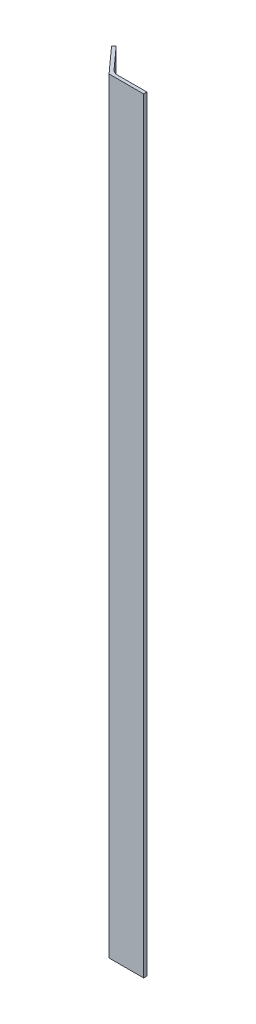
ISO-10303-21;
HEADER;
FILE_DESCRIPTION(('STEP AP214'),'2;1');
FILE_NAME('part.step','',(''),(''),'','','');
FILE_SCHEMA(('AUTOMOTIVE_DESIGN { 1 0 10303 214 1 1 1 1 }'));
ENDSEC;
DATA;
#1=APPLICATION_CONTEXT('core data for automotive mechanical design processes');
#2=APPLICATION_PROTOCOL_DEFINITION('international standard','automotive_design',2000,#1);
#3=PRODUCT_CONTEXT('',#1,'mechanical');
#4=PRODUCT('Part','Part','',(#3));
#5=PRODUCT_RELATED_PRODUCT_CATEGORY('part','',(#4));
#6=PRODUCT_DEFINITION_FORMATION('','',#4);
#7=PRODUCT_DEFINITION_CONTEXT('part definition',#1,'design');
#8=PRODUCT_DEFINITION('design','',#6,#7);
#9=PRODUCT_DEFINITION_SHAPE('','',#8);
#10=(LENGTH_UNIT() NAMED_UNIT(*) SI_UNIT(.MILLI.,.METRE.));
#11=(NAMED_UNIT(*) PLANE_ANGLE_UNIT() SI_UNIT($,.RADIAN.));
#12=(NAMED_UNIT(*) SI_UNIT($,.STERADIAN.) SOLID_ANGLE_UNIT());
#13=UNCERTAINTY_MEASURE_WITH_UNIT(LENGTH_MEASURE(1.E-05),#10,'distance_accuracy_value','');
#14=(GEOMETRIC_REPRESENTATION_CONTEXT(3) GLOBAL_UNCERTAINTY_ASSIGNED_CONTEXT((#13)) GLOBAL_UNIT_ASSIGNED_CONTEXT((#10,
#11,#12)) REPRESENTATION_CONTEXT('',''));
#15=CARTESIAN_POINT('',(0.,0.,0.));
#16=DIRECTION('',(0.,0.,1.));
#17=DIRECTION('',(1.,0.,0.));
#18=AXIS2_PLACEMENT_3D('',#15,#16,#17);
#19=CARTESIAN_POINT('',(-0.931762463434703,40.,-5.48688166985293));
#20=DIRECTION('',(0.,-1.,0.));
#21=DIRECTION('',(0.,0.,-1.));
#22=AXIS2_PLACEMENT_3D('',#19,#20,#21);
#23=PLANE('',#22);
#24=CARTESIAN_POINT('',(-0.931762463434703,40.,-5.48688166985293));
#25=DIRECTION('',(0.,-1.,0.));
#26=DIRECTION('',(0.,0.,-1.));
#27=AXIS2_PLACEMENT_3D('',#24,#25,#26);
#28=CIRCLE('',#27,5.);
#29=CARTESIAN_POINT('',(-0.931762463434703,40.,-0.486881669852926));
#30=VERTEX_POINT('',#29);
#31=CARTESIAN_POINT('',(-4.64357419114649,40.,-2.13688858060315));
#32=VERTEX_POINT('',#31);
#33=EDGE_CURVE('E106',#30,#32,#28,.T.);
#34=ORIENTED_EDGE('',*,*,#33,.F.);
#35=DIRECTION('',(-1.,0.,0.));
#36=VECTOR('',#35,1.);
#37=CARTESIAN_POINT('',(-0.931762463434703,40.,-0.486881669852926));
#38=LINE('',#37,#36);
#39=CARTESIAN_POINT('',(17.1228290420735,40.,-0.486881669852926));
#40=VERTEX_POINT('',#39);
#41=EDGE_CURVE('E127',#40,#30,#38,.T.);
#42=ORIENTED_EDGE('',*,*,#41,.F.);
#43=DIRECTION('',(0.,0.,-1.));
#44=VECTOR('',#43,1.);
#45=CARTESIAN_POINT('',(17.1228290420735,40.,1.51311833014707));
#46=LINE('',#45,#44);
#47=CARTESIAN_POINT('',(17.1228290420735,40.,1.51311833014707));
#48=VERTEX_POINT('',#47);
#49=EDGE_CURVE('E124',#48,#40,#46,.T.);
#50=ORIENTED_EDGE('',*,*,#49,.F.);
#51=DIRECTION('',(1.,0.,0.));
#52=VECTOR('',#51,1.);
#53=CARTESIAN_POINT('',(-4.04346349315579,40.,1.51311833014707));
#54=LINE('',#53,#52);
#55=CARTESIAN_POINT('',(-4.04346349315579,40.,1.51311833014707));
#56=VERTEX_POINT('',#55);
#57=EDGE_CURVE('E121',#56,#48,#54,.T.);
#58=ORIENTED_EDGE('',*,*,#57,.F.);
#59=DIRECTION('',(0.669998617849955,0.,0.742362345542357));
#60=VECTOR('',#59,1.);
#61=CARTESIAN_POINT('',(-18.0829321574702,40.,-14.0426941896676));
#62=LINE('',#61,#60);
#63=CARTESIAN_POINT('',(-18.0829321574702,40.,-14.0426941896676));
#64=VERTEX_POINT('',#63);
#65=EDGE_CURVE('E118',#64,#56,#62,.T.);
#66=ORIENTED_EDGE('',*,*,#65,.F.);
#67=DIRECTION('',(-0.742362345542357,0.,0.669998617849955));
#68=VECTOR('',#67,1.);
#69=CARTESIAN_POINT('',(-18.0829321574702,40.,-14.0426941896676));
#70=LINE('',#69,#68);
#71=CARTESIAN_POINT('',(-16.5982074663855,40.,-15.3826914253675));
#72=VERTEX_POINT('',#71);
#73=EDGE_CURVE('E109',#72,#64,#70,.T.);
#74=ORIENTED_EDGE('',*,*,#73,.F.);
#75=DIRECTION('',(-0.669998617849955,0.,-0.742362345542357));
#76=VECTOR('',#75,1.);
#77=CARTESIAN_POINT('',(-16.5982074663855,40.,-15.3826914253675));
#78=LINE('',#77,#76);
#79=EDGE_CURVE('E98',#32,#72,#78,.T.);
#80=ORIENTED_EDGE('',*,*,#79,.F.);
#81=EDGE_LOOP('',(#34,#42,#50,#58,#66,#74,#80));
#82=FACE_BOUND('',#81,.T.);
#83=ADVANCED_FACE('F33',(#82),#23,.T.);
#84=CARTESIAN_POINT('',(-0.931762463434703,547.26382067791,-0.486881669852926));
#85=DIRECTION('',(0.,0.,1.));
#86=DIRECTION('',(1.,0.,0.));
#87=AXIS2_PLACEMENT_3D('',#84,#85,#86);
#88=PLANE('',#87);
#89=DIRECTION('',(0.,-1.,0.));
#90=VECTOR('',#89,1.);
#91=CARTESIAN_POINT('',(-0.931762463434703,547.26382067791,-0.486881669852926));
#92=LINE('',#91,#90);
#93=CARTESIAN_POINT('',(-0.931762463434703,508.213673316679,-0.486881669852926));
#94=VERTEX_POINT('',#93);
#95=EDGE_CURVE('E112',#94,#30,#92,.T.);
#96=ORIENTED_EDGE('',*,*,#95,.F.);
#97=DIRECTION('',(1.,0.,0.));
#98=VECTOR('',#97,1.);
#99=CARTESIAN_POINT('',(-0.931762463434703,508.213673316679,-0.486881669852926));
#100=LINE('',#99,#98);
#101=CARTESIAN_POINT('',(17.1228290420735,508.213673316679,-0.486881669852926));
#102=VERTEX_POINT('',#101);
#103=EDGE_CURVE('E37',#94,#102,#100,.T.);
#104=ORIENTED_EDGE('',*,*,#103,.T.);
#105=DIRECTION('',(0.,-1.,0.));
#106=VECTOR('',#105,1.);
#107=CARTESIAN_POINT('',(17.1228290420735,547.26382067791,-0.486881669852926));
#108=LINE('',#107,#106);
#109=EDGE_CURVE('E130',#102,#40,#108,.T.);
#110=ORIENTED_EDGE('',*,*,#109,.T.);
#111=ORIENTED_EDGE('',*,*,#41,.T.);
#112=EDGE_LOOP('',(#96,#104,#110,#111));
#113=FACE_BOUND('',#112,.T.);
#114=ADVANCED_FACE('F152',(#113),#88,.F.);
#115=CARTESIAN_POINT('',(17.1228290420735,547.26382067791,1.51311833014707));
#116=DIRECTION('',(-1.,0.,0.));
#117=DIRECTION('',(0.,0.,1.));
#118=AXIS2_PLACEMENT_3D('',#115,#116,#117);
#119=PLANE('',#118);
#120=ORIENTED_EDGE('',*,*,#109,.F.);
#121=DIRECTION('',(0.,0.,1.));
#122=VECTOR('',#121,1.);
#123=CARTESIAN_POINT('',(17.1228290420735,508.213673316679,1.51311833014707));
#124=LINE('',#123,#122);
#125=CARTESIAN_POINT('',(17.1228290420735,508.213673316679,1.51311833014707));
#126=VERTEX_POINT('',#125);
#127=EDGE_CURVE('E146',#102,#126,#124,.T.);
#128=ORIENTED_EDGE('',*,*,#127,.T.);
#129=DIRECTION('',(0.,-1.,0.));
#130=VECTOR('',#129,1.);
#131=CARTESIAN_POINT('',(17.1228290420735,547.26382067791,1.51311833014707));
#132=LINE('',#131,#130);
#133=EDGE_CURVE('E132',#126,#48,#132,.T.);
#134=ORIENTED_EDGE('',*,*,#133,.T.);
#135=ORIENTED_EDGE('',*,*,#49,.T.);
#136=EDGE_LOOP('',(#120,#128,#134,#135));
#137=FACE_BOUND('',#136,.T.);
#138=ADVANCED_FACE('F154',(#137),#119,.F.);
#139=CARTESIAN_POINT('',(-4.04346349315579,547.26382067791,1.51311833014707));
#140=DIRECTION('',(0.,0.,-1.));
#141=DIRECTION('',(-1.,0.,0.));
#142=AXIS2_PLACEMENT_3D('',#139,#140,#141);
#143=PLANE('',#142);
#144=ORIENTED_EDGE('',*,*,#133,.F.);
#145=DIRECTION('',(-1.,0.,0.));
#146=VECTOR('',#145,1.);
#147=CARTESIAN_POINT('',(-4.04346349315579,508.213673316679,1.51311833014707));
#148=LINE('',#147,#146);
#149=CARTESIAN_POINT('',(-4.04346349315579,508.213673316679,1.51311833014707));
#150=VERTEX_POINT('',#149);
#151=EDGE_CURVE('E52',#126,#150,#148,.T.);
#152=ORIENTED_EDGE('',*,*,#151,.T.);
#153=DIRECTION('',(0.,-1.,0.));
#154=VECTOR('',#153,1.);
#155=CARTESIAN_POINT('',(-4.04346349315579,547.26382067791,1.51311833014707));
#156=LINE('',#155,#154);
#157=EDGE_CURVE('E134',#150,#56,#156,.T.);
#158=ORIENTED_EDGE('',*,*,#157,.T.);
#159=ORIENTED_EDGE('',*,*,#57,.T.);
#160=EDGE_LOOP('',(#144,#152,#158,#159));
#161=FACE_BOUND('',#160,.T.);
#162=ADVANCED_FACE('F158',(#161),#143,.F.);
#163=CARTESIAN_POINT('',(-18.0829321574702,547.26382067791,-14.0426941896676));
#164=DIRECTION('',(0.742362345542357,0.,-0.669998617849955));
#165=DIRECTION('',(-0.669998617849955,0.,-0.742362345542357));
#166=AXIS2_PLACEMENT_3D('',#163,#164,#165);
#167=PLANE('',#166);
#168=ORIENTED_EDGE('',*,*,#157,.F.);
#169=DIRECTION('',(-0.669998617849955,0.,-0.742362345542357));
#170=VECTOR('',#169,1.);
#171=CARTESIAN_POINT('',(-18.0829321574702,508.213673316679,-14.0426941896676));
#172=LINE('',#171,#170);
#173=CARTESIAN_POINT('',(-18.0829321574702,508.213673316679,-14.0426941896676));
#174=VERTEX_POINT('',#173);
#175=EDGE_CURVE('E141',#150,#174,#172,.T.);
#176=ORIENTED_EDGE('',*,*,#175,.T.);
#177=DIRECTION('',(0.,-1.,0.));
#178=VECTOR('',#177,1.);
#179=CARTESIAN_POINT('',(-18.0829321574702,547.26382067791,-14.0426941896676));
#180=LINE('',#179,#178);
#181=EDGE_CURVE('E136',#174,#64,#180,.T.);
#182=ORIENTED_EDGE('',*,*,#181,.T.);
#183=ORIENTED_EDGE('',*,*,#65,.T.);
#184=EDGE_LOOP('',(#168,#176,#182,#183));
#185=FACE_BOUND('',#184,.T.);
#186=ADVANCED_FACE('F161',(#185),#167,.F.);
#187=CARTESIAN_POINT('',(-18.0829321574702,547.26382067791,-14.0426941896676));
#188=DIRECTION('',(0.669998617849955,0.,0.742362345542357));
#189=DIRECTION('',(0.742362345542357,0.,-0.669998617849955));
#190=AXIS2_PLACEMENT_3D('',#187,#188,#189);
#191=PLANE('',#190);
#192=ORIENTED_EDGE('',*,*,#181,.F.);
#193=DIRECTION('',(0.742362345542357,0.,-0.669998617849955));
#194=VECTOR('',#193,1.);
#195=CARTESIAN_POINT('',(-18.0829321574702,508.213673316679,-14.0426941896676));
#196=LINE('',#195,#194);
#197=CARTESIAN_POINT('',(-16.5982074663855,508.213673316679,-15.3826914253675));
#198=VERTEX_POINT('',#197);
#199=EDGE_CURVE('E62',#174,#198,#196,.T.);
#200=ORIENTED_EDGE('',*,*,#199,.T.);
#201=DIRECTION('',(0.,-1.,0.));
#202=VECTOR('',#201,1.);
#203=CARTESIAN_POINT('',(-16.5982074663855,547.26382067791,-15.3826914253675));
#204=LINE('',#203,#202);
#205=EDGE_CURVE('E102',#198,#72,#204,.T.);
#206=ORIENTED_EDGE('',*,*,#205,.T.);
#207=ORIENTED_EDGE('',*,*,#73,.T.);
#208=EDGE_LOOP('',(#192,#200,#206,#207));
#209=FACE_BOUND('',#208,.T.);
#210=ADVANCED_FACE('F139',(#209),#191,.F.);
#211=CARTESIAN_POINT('',(-16.5982074663855,547.26382067791,-15.3826914253675));
#212=DIRECTION('',(-0.742362345542357,0.,0.669998617849955));
#213=DIRECTION('',(0.669998617849955,0.,0.742362345542357));
#214=AXIS2_PLACEMENT_3D('',#211,#212,#213);
#215=PLANE('',#214);
#216=ORIENTED_EDGE('',*,*,#205,.F.);
#217=DIRECTION('',(0.669998617849955,0.,0.742362345542357));
#218=VECTOR('',#217,1.);
#219=CARTESIAN_POINT('',(-16.5982074663855,508.213673316679,-15.3826914253675));
#220=LINE('',#219,#218);
#221=CARTESIAN_POINT('',(-4.64357419114649,508.213673316679,-2.13688858060315));
#222=VERTEX_POINT('',#221);
#223=EDGE_CURVE('E43',#198,#222,#220,.T.);
#224=ORIENTED_EDGE('',*,*,#223,.T.);
#225=DIRECTION('',(0.,-1.,0.));
#226=VECTOR('',#225,1.);
#227=CARTESIAN_POINT('',(-4.64357419114649,547.26382067791,-2.13688858060315));
#228=LINE('',#227,#226);
#229=EDGE_CURVE('E95',#222,#32,#228,.T.);
#230=ORIENTED_EDGE('',*,*,#229,.T.);
#231=ORIENTED_EDGE('',*,*,#79,.T.);
#232=EDGE_LOOP('',(#216,#224,#230,#231));
#233=FACE_BOUND('',#232,.T.);
#234=ADVANCED_FACE('F97',(#233),#215,.F.);
#235=CARTESIAN_POINT('',(-0.931762463434703,547.26382067791,-5.48688166985293));
#236=DIRECTION('',(0.,-1.,0.));
#237=DIRECTION('',(0.,0.,-1.));
#238=AXIS2_PLACEMENT_3D('',#235,#236,#237);
#239=CYLINDRICAL_SURFACE('',#238,5.);
#240=ORIENTED_EDGE('',*,*,#229,.F.);
#241=CARTESIAN_POINT('',(-0.931762463434703,508.213673316679,-5.48688166985293));
#242=DIRECTION('',(0.,-1.,0.));
#243=DIRECTION('',(0.,0.,-1.));
#244=AXIS2_PLACEMENT_3D('',#241,#242,#243);
#245=CIRCLE('',#244,5.);
#246=EDGE_CURVE('E11',#222,#94,#245,.F.);
#247=ORIENTED_EDGE('',*,*,#246,.T.);
#248=ORIENTED_EDGE('',*,*,#95,.T.);
#249=ORIENTED_EDGE('',*,*,#33,.T.);
#250=EDGE_LOOP('',(#240,#247,#248,#249));
#251=FACE_BOUND('',#250,.T.);
#252=ADVANCED_FACE('F35',(#251),#239,.F.);
#253=CARTESIAN_POINT('',(-4.06974647727207,508.213673316679,1.45618794192231));
#254=DIRECTION('',(0.,-1.,0.));
#255=DIRECTION('',(0.999983824753034,0.,0.00568772646077009));
#256=AXIS2_PLACEMENT_3D('',#253,#254,#255);
#257=PLANE('',#256);
#258=ORIENTED_EDGE('',*,*,#223,.F.);
#259=ORIENTED_EDGE('',*,*,#199,.F.);
#260=ORIENTED_EDGE('',*,*,#175,.F.);
#261=ORIENTED_EDGE('',*,*,#151,.F.);
#262=ORIENTED_EDGE('',*,*,#127,.F.);
#263=ORIENTED_EDGE('',*,*,#103,.F.);
#264=ORIENTED_EDGE('',*,*,#246,.F.);
#265=EDGE_LOOP('',(#258,#259,#260,#261,#262,#263,#264));
#266=FACE_BOUND('',#265,.T.);
#267=ADVANCED_FACE('F153',(#266),#257,.F.);
#268=CLOSED_SHELL('',(#83,#114,#138,#162,#186,#210,#234,#252,#267));
#269=MANIFOLD_SOLID_BREP('B2',#268);
#270=ADVANCED_BREP_SHAPE_REPRESENTATION('',(#18,#269),#14);
#271=SHAPE_DEFINITION_REPRESENTATION(#9,#270);
ENDSEC;
END-ISO-10303-21;
